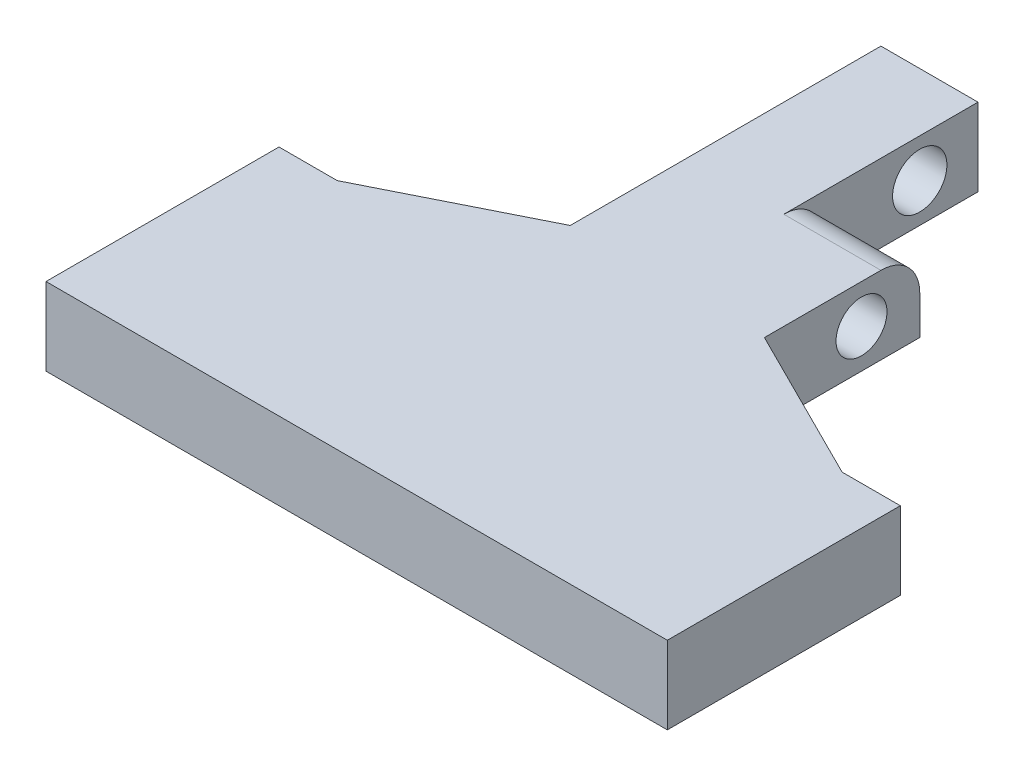
ISO-10303-21;
HEADER;
FILE_DESCRIPTION(('STEP AP214'),'2;1');
FILE_NAME('part.step','',(''),(''),'','','');
FILE_SCHEMA(('AUTOMOTIVE_DESIGN { 1 0 10303 214 1 1 1 1 }'));
ENDSEC;
DATA;
#1=APPLICATION_CONTEXT('core data for automotive mechanical design processes');
#2=APPLICATION_PROTOCOL_DEFINITION('international standard','automotive_design',2000,#1);
#3=PRODUCT_CONTEXT('',#1,'mechanical');
#4=PRODUCT('Part','Part','',(#3));
#5=PRODUCT_RELATED_PRODUCT_CATEGORY('part','',(#4));
#6=PRODUCT_DEFINITION_FORMATION('','',#4);
#7=PRODUCT_DEFINITION_CONTEXT('part definition',#1,'design');
#8=PRODUCT_DEFINITION('design','',#6,#7);
#9=PRODUCT_DEFINITION_SHAPE('','',#8);
#10=(LENGTH_UNIT() NAMED_UNIT(*) SI_UNIT(.MILLI.,.METRE.));
#11=(NAMED_UNIT(*) PLANE_ANGLE_UNIT() SI_UNIT($,.RADIAN.));
#12=(NAMED_UNIT(*) SI_UNIT($,.STERADIAN.) SOLID_ANGLE_UNIT());
#13=UNCERTAINTY_MEASURE_WITH_UNIT(LENGTH_MEASURE(1.E-05),#10,'distance_accuracy_value','');
#14=(GEOMETRIC_REPRESENTATION_CONTEXT(3) GLOBAL_UNCERTAINTY_ASSIGNED_CONTEXT((#13)) GLOBAL_UNIT_ASSIGNED_CONTEXT((#10,
#11,#12)) REPRESENTATION_CONTEXT('',''));
#15=CARTESIAN_POINT('',(0.,0.,0.));
#16=DIRECTION('',(0.,0.,1.));
#17=DIRECTION('',(1.,0.,0.));
#18=AXIS2_PLACEMENT_3D('',#15,#16,#17);
#19=CARTESIAN_POINT('',(0.,6.35,-7.37962983447136));
#20=DIRECTION('',(0.,0.,-1.));
#21=DIRECTION('',(-1.,0.,0.));
#22=AXIS2_PLACEMENT_3D('',#19,#20,#21);
#23=PLANE('',#22);
#24=DIRECTION('',(1.,0.,0.));
#25=VECTOR('',#24,1.);
#26=CARTESIAN_POINT('',(0.,0.,-7.37962983447136));
#27=LINE('',#26,#25);
#28=CARTESIAN_POINT('',(68.0048095270401,0.,-7.37962983447136));
#29=VERTEX_POINT('',#28);
#30=CARTESIAN_POINT('',(72.7673095270401,0.,-7.37962983447136));
#31=VERTEX_POINT('',#30);
#32=EDGE_CURVE('E214',#29,#31,#27,.T.);
#33=ORIENTED_EDGE('',*,*,#32,.F.);
#34=DIRECTION('',(0.,-1.,0.));
#35=VECTOR('',#34,1.);
#36=CARTESIAN_POINT('',(68.0048095270401,6.35,-7.37962983447136));
#37=LINE('',#36,#35);
#38=CARTESIAN_POINT('',(68.0048095270401,6.35,-7.37962983447136));
#39=VERTEX_POINT('',#38);
#40=EDGE_CURVE('E274',#39,#29,#37,.T.);
#41=ORIENTED_EDGE('',*,*,#40,.F.);
#42=DIRECTION('',(1.,0.,0.));
#43=VECTOR('',#42,1.);
#44=CARTESIAN_POINT('',(0.,6.35,-7.37962983447136));
#45=LINE('',#44,#43);
#46=CARTESIAN_POINT('',(72.7673095270401,6.35,-7.37962983447136));
#47=VERTEX_POINT('',#46);
#48=EDGE_CURVE('E177',#39,#47,#45,.T.);
#49=ORIENTED_EDGE('',*,*,#48,.T.);
#50=DIRECTION('',(0.,-1.,0.));
#51=VECTOR('',#50,1.);
#52=CARTESIAN_POINT('',(72.7673095270401,6.35,-7.37962983447136));
#53=LINE('',#52,#51);
#54=EDGE_CURVE('E213',#47,#31,#53,.T.);
#55=ORIENTED_EDGE('',*,*,#54,.T.);
#56=EDGE_LOOP('',(#33,#41,#49,#55));
#57=FACE_BOUND('',#56,.T.);
#58=ADVANCED_FACE('F41',(#57),#23,.T.);
#59=CARTESIAN_POINT('',(16.5528138391965,6.35,-33.1056276783931));
#60=DIRECTION('',(-0.447213595499957,0.,0.894427190999916));
#61=DIRECTION('',(0.894427190999916,0.,0.447213595499957));
#62=AXIS2_PLACEMENT_3D('',#59,#60,#61);
#63=PLANE('',#62);
#64=DIRECTION('',(-0.894427190999916,0.,-0.447213595499957));
#65=VECTOR('',#64,1.);
#66=CARTESIAN_POINT('',(16.5528138391965,0.,-33.1056276783931));
#67=LINE('',#66,#65);
#68=CARTESIAN_POINT('',(55.3048095270401,0.,-13.7296298344713));
#69=VERTEX_POINT('',#68);
#70=EDGE_CURVE('E218',#29,#69,#67,.T.);
#71=ORIENTED_EDGE('',*,*,#70,.T.);
#72=DIRECTION('',(0.,-1.,0.));
#73=VECTOR('',#72,1.);
#74=CARTESIAN_POINT('',(55.3048095270401,6.35,-13.7296298344713));
#75=LINE('',#74,#73);
#76=CARTESIAN_POINT('',(55.3048095270401,6.35,-13.7296298344713));
#77=VERTEX_POINT('',#76);
#78=EDGE_CURVE('E270',#77,#69,#75,.T.);
#79=ORIENTED_EDGE('',*,*,#78,.F.);
#80=DIRECTION('',(-0.894427190999916,0.,-0.447213595499957));
#81=VECTOR('',#80,1.);
#82=CARTESIAN_POINT('',(16.5528138391965,6.35,-33.1056276783931));
#83=LINE('',#82,#81);
#84=EDGE_CURVE('E181',#39,#77,#83,.T.);
#85=ORIENTED_EDGE('',*,*,#84,.F.);
#86=ORIENTED_EDGE('',*,*,#40,.T.);
#87=EDGE_LOOP('',(#71,#79,#85,#86));
#88=FACE_BOUND('',#87,.T.);
#89=ADVANCED_FACE('F333',(#88),#63,.F.);
#90=CARTESIAN_POINT('',(55.3048095270401,6.35,0.));
#91=DIRECTION('',(-1.,0.,0.));
#92=DIRECTION('',(0.,0.,1.));
#93=AXIS2_PLACEMENT_3D('',#90,#91,#92);
#94=PLANE('',#93);
#95=CARTESIAN_POINT('',(55.3048095270401,3.175,-21.6671298344713));
#96=DIRECTION('',(1.,0.,0.));
#97=DIRECTION('',(0.,0.,-1.));
#98=AXIS2_PLACEMENT_3D('',#95,#96,#97);
#99=CIRCLE('',#98,2.0828);
#100=CARTESIAN_POINT('',(55.3048095270401,3.175,-23.7499298344713));
#101=VERTEX_POINT('',#100);
#102=EDGE_CURVE('E172',#101,#101,#99,.T.);
#103=ORIENTED_EDGE('',*,*,#102,.F.);
#104=EDGE_LOOP('',(#103));
#105=FACE_BOUND('',#104,.T.);
#106=DIRECTION('',(0.,1.,0.));
#107=VECTOR('',#106,1.);
#108=CARTESIAN_POINT('',(55.3048095270401,0.,-26.4296298344714));
#109=LINE('',#108,#107);
#110=CARTESIAN_POINT('',(55.3048095270401,0.,-26.4296298344714));
#111=VERTEX_POINT('',#110);
#112=CARTESIAN_POINT('',(55.3048095270401,3.175,-26.4296298344714));
#113=VERTEX_POINT('',#112);
#114=EDGE_CURVE('E147',#111,#113,#109,.T.);
#115=ORIENTED_EDGE('',*,*,#114,.T.);
#116=CARTESIAN_POINT('',(55.3048095270401,3.175,-23.2546298344714));
#117=DIRECTION('',(-1.,0.,0.));
#118=DIRECTION('',(0.,0.,1.));
#119=AXIS2_PLACEMENT_3D('',#116,#117,#118);
#120=CIRCLE('',#119,3.175);
#121=CARTESIAN_POINT('',(55.3048095270401,6.35,-23.2546298344714));
#122=VERTEX_POINT('',#121);
#123=EDGE_CURVE('E64',#113,#122,#120,.F.);
#124=ORIENTED_EDGE('',*,*,#123,.T.);
#125=DIRECTION('',(0.,0.,-1.));
#126=VECTOR('',#125,1.);
#127=CARTESIAN_POINT('',(55.3048095270401,6.35,0.));
#128=LINE('',#127,#126);
#129=EDGE_CURVE('E185',#77,#122,#128,.T.);
#130=ORIENTED_EDGE('',*,*,#129,.F.);
#131=ORIENTED_EDGE('',*,*,#78,.T.);
#132=DIRECTION('',(0.,0.,-1.));
#133=VECTOR('',#132,1.);
#134=CARTESIAN_POINT('',(55.3048095270401,0.,0.));
#135=LINE('',#134,#133);
#136=EDGE_CURVE('E222',#69,#111,#135,.T.);
#137=ORIENTED_EDGE('',*,*,#136,.T.);
#138=EDGE_LOOP('',(#115,#124,#130,#131,#137));
#139=FACE_BOUND('',#138,.T.);
#140=ADVANCED_FACE('F296',(#105,#139),#94,.F.);
#141=CARTESIAN_POINT('',(0.,6.35,-39.1296298344714));
#142=DIRECTION('',(0.,0.,1.));
#143=DIRECTION('',(1.,0.,0.));
#144=AXIS2_PLACEMENT_3D('',#141,#142,#143);
#145=PLANE('',#144);
#146=DIRECTION('',(-1.,0.,0.));
#147=VECTOR('',#146,1.);
#148=CARTESIAN_POINT('',(0.,6.35,-39.1296298344714));
#149=LINE('',#148,#147);
#150=CARTESIAN_POINT('',(47.3673095270401,6.35,-39.1296298344714));
#151=VERTEX_POINT('',#150);
#152=CARTESIAN_POINT('',(39.4298095270401,6.35,-39.1296298344714));
#153=VERTEX_POINT('',#152);
#154=EDGE_CURVE('E188',#151,#153,#149,.T.);
#155=ORIENTED_EDGE('',*,*,#154,.F.);
#156=DIRECTION('',(0.,1.,0.));
#157=VECTOR('',#156,1.);
#158=CARTESIAN_POINT('',(47.3673095270401,0.,-39.1296298344714));
#159=LINE('',#158,#157);
#160=CARTESIAN_POINT('',(47.3673095270401,0.,-39.1296298344714));
#161=VERTEX_POINT('',#160);
#162=EDGE_CURVE('E166',#161,#151,#159,.T.);
#163=ORIENTED_EDGE('',*,*,#162,.F.);
#164=DIRECTION('',(-1.,0.,0.));
#165=VECTOR('',#164,1.);
#166=CARTESIAN_POINT('',(0.,0.,-39.1296298344714));
#167=LINE('',#166,#165);
#168=CARTESIAN_POINT('',(39.4298095270401,0.,-39.1296298344714));
#169=VERTEX_POINT('',#168);
#170=EDGE_CURVE('E160',#161,#169,#167,.T.);
#171=ORIENTED_EDGE('',*,*,#170,.T.);
#172=DIRECTION('',(0.,-1.,0.));
#173=VECTOR('',#172,1.);
#174=CARTESIAN_POINT('',(39.4298095270401,6.35,-39.1296298344714));
#175=LINE('',#174,#173);
#176=EDGE_CURVE('E266',#153,#169,#175,.T.);
#177=ORIENTED_EDGE('',*,*,#176,.F.);
#178=EDGE_LOOP('',(#155,#163,#171,#177));
#179=FACE_BOUND('',#178,.T.);
#180=ADVANCED_FACE('F332',(#179),#145,.F.);
#181=CARTESIAN_POINT('',(39.4298095270401,6.35,0.));
#182=DIRECTION('',(-1.,0.,0.));
#183=DIRECTION('',(0.,0.,1.));
#184=AXIS2_PLACEMENT_3D('',#181,#182,#183);
#185=PLANE('',#184);
#186=CARTESIAN_POINT('',(39.4298095270401,3.175,-21.6671298344713));
#187=DIRECTION('',(-1.,0.,0.));
#188=DIRECTION('',(0.,0.,1.));
#189=AXIS2_PLACEMENT_3D('',#186,#187,#188);
#190=CIRCLE('',#189,2.0828);
#191=CARTESIAN_POINT('',(39.4298095270401,3.175,-19.5843298344714));
#192=VERTEX_POINT('',#191);
#193=EDGE_CURVE('E219',#192,#192,#190,.T.);
#194=ORIENTED_EDGE('',*,*,#193,.F.);
#195=EDGE_LOOP('',(#194));
#196=FACE_BOUND('',#195,.T.);
#197=CARTESIAN_POINT('',(39.4298095270401,3.175,-34.3671298344714));
#198=DIRECTION('',(-1.,0.,0.));
#199=DIRECTION('',(0.,0.,1.));
#200=AXIS2_PLACEMENT_3D('',#197,#198,#199);
#201=CIRCLE('',#200,2.2225);
#202=CARTESIAN_POINT('',(39.4298095270401,3.175,-32.1446298344714));
#203=VERTEX_POINT('',#202);
#204=EDGE_CURVE('E176',#203,#203,#201,.T.);
#205=ORIENTED_EDGE('',*,*,#204,.F.);
#206=EDGE_LOOP('',(#205));
#207=FACE_BOUND('',#206,.T.);
#208=DIRECTION('',(0.,0.,-1.));
#209=VECTOR('',#208,1.);
#210=CARTESIAN_POINT('',(39.4298095270401,0.,0.));
#211=LINE('',#210,#209);
#212=CARTESIAN_POINT('',(39.4298095270401,0.,-13.7296298344714));
#213=VERTEX_POINT('',#212);
#214=EDGE_CURVE('E227',#213,#169,#211,.T.);
#215=ORIENTED_EDGE('',*,*,#214,.F.);
#216=DIRECTION('',(0.,-1.,0.));
#217=VECTOR('',#216,1.);
#218=CARTESIAN_POINT('',(39.4298095270401,6.35,-13.7296298344714));
#219=LINE('',#218,#217);
#220=CARTESIAN_POINT('',(39.4298095270401,6.35,-13.7296298344714));
#221=VERTEX_POINT('',#220);
#222=EDGE_CURVE('E263',#221,#213,#219,.T.);
#223=ORIENTED_EDGE('',*,*,#222,.F.);
#224=DIRECTION('',(0.,0.,-1.));
#225=VECTOR('',#224,1.);
#226=CARTESIAN_POINT('',(39.4298095270401,6.35,0.));
#227=LINE('',#226,#225);
#228=EDGE_CURVE('E191',#221,#153,#227,.T.);
#229=ORIENTED_EDGE('',*,*,#228,.T.);
#230=ORIENTED_EDGE('',*,*,#176,.T.);
#231=EDGE_LOOP('',(#215,#223,#229,#230));
#232=FACE_BOUND('',#231,.T.);
#233=ADVANCED_FACE('F329',(#196,#207,#232),#185,.T.);
#234=CARTESIAN_POINT('',(2.39410997161946,6.35,4.78821994323893));
#235=DIRECTION('',(-0.447213595499957,0.,-0.894427190999916));
#236=DIRECTION('',(-0.894427190999916,0.,0.447213595499957));
#237=AXIS2_PLACEMENT_3D('',#234,#235,#236);
#238=PLANE('',#237);
#239=DIRECTION('',(0.894427190999916,0.,-0.447213595499957));
#240=VECTOR('',#239,1.);
#241=CARTESIAN_POINT('',(2.39410997161946,0.,4.78821994323893));
#242=LINE('',#241,#240);
#243=CARTESIAN_POINT('',(26.7298095270401,0.,-7.37962983447136));
#244=VERTEX_POINT('',#243);
#245=EDGE_CURVE('E230',#244,#213,#242,.T.);
#246=ORIENTED_EDGE('',*,*,#245,.F.);
#247=DIRECTION('',(0.,-1.,0.));
#248=VECTOR('',#247,1.);
#249=CARTESIAN_POINT('',(26.7298095270401,6.35,-7.37962983447136));
#250=LINE('',#249,#248);
#251=CARTESIAN_POINT('',(26.7298095270401,6.35,-7.37962983447136));
#252=VERTEX_POINT('',#251);
#253=EDGE_CURVE('E260',#252,#244,#250,.T.);
#254=ORIENTED_EDGE('',*,*,#253,.F.);
#255=DIRECTION('',(0.894427190999916,0.,-0.447213595499957));
#256=VECTOR('',#255,1.);
#257=CARTESIAN_POINT('',(2.39410997161946,6.35,4.78821994323893));
#258=LINE('',#257,#256);
#259=EDGE_CURVE('E195',#252,#221,#258,.T.);
#260=ORIENTED_EDGE('',*,*,#259,.T.);
#261=ORIENTED_EDGE('',*,*,#222,.T.);
#262=EDGE_LOOP('',(#246,#254,#260,#261));
#263=FACE_BOUND('',#262,.T.);
#264=ADVANCED_FACE('F325',(#263),#238,.T.);
#265=CARTESIAN_POINT('',(0.,6.35,-7.37962983447136));
#266=DIRECTION('',(0.,0.,-1.));
#267=DIRECTION('',(-1.,0.,0.));
#268=AXIS2_PLACEMENT_3D('',#265,#266,#267);
#269=PLANE('',#268);
#270=DIRECTION('',(1.,0.,0.));
#271=VECTOR('',#270,1.);
#272=CARTESIAN_POINT('',(0.,0.,-7.37962983447136));
#273=LINE('',#272,#271);
#274=CARTESIAN_POINT('',(21.9673095270401,0.,-7.37962983447136));
#275=VERTEX_POINT('',#274);
#276=EDGE_CURVE('E234',#275,#244,#273,.T.);
#277=ORIENTED_EDGE('',*,*,#276,.F.);
#278=DIRECTION('',(0.,-1.,0.));
#279=VECTOR('',#278,1.);
#280=CARTESIAN_POINT('',(21.9673095270401,6.35,-7.37962983447136));
#281=LINE('',#280,#279);
#282=CARTESIAN_POINT('',(21.9673095270401,6.35,-7.37962983447136));
#283=VERTEX_POINT('',#282);
#284=EDGE_CURVE('E257',#283,#275,#281,.T.);
#285=ORIENTED_EDGE('',*,*,#284,.F.);
#286=DIRECTION('',(1.,0.,0.));
#287=VECTOR('',#286,1.);
#288=CARTESIAN_POINT('',(0.,6.35,-7.37962983447136));
#289=LINE('',#288,#287);
#290=EDGE_CURVE('E199',#283,#252,#289,.T.);
#291=ORIENTED_EDGE('',*,*,#290,.T.);
#292=ORIENTED_EDGE('',*,*,#253,.T.);
#293=EDGE_LOOP('',(#277,#285,#291,#292));
#294=FACE_BOUND('',#293,.T.);
#295=ADVANCED_FACE('F321',(#294),#269,.T.);
#296=CARTESIAN_POINT('',(21.9673095270401,6.35,0.));
#297=DIRECTION('',(1.,0.,0.));
#298=DIRECTION('',(0.,0.,-1.));
#299=AXIS2_PLACEMENT_3D('',#296,#297,#298);
#300=PLANE('',#299);
#301=DIRECTION('',(0.,0.,1.));
#302=VECTOR('',#301,1.);
#303=CARTESIAN_POINT('',(21.9673095270401,0.,0.));
#304=LINE('',#303,#302);
#305=CARTESIAN_POINT('',(21.9673095270401,0.,11.6703701655286));
#306=VERTEX_POINT('',#305);
#307=EDGE_CURVE('E238',#275,#306,#304,.T.);
#308=ORIENTED_EDGE('',*,*,#307,.T.);
#309=DIRECTION('',(0.,-1.,0.));
#310=VECTOR('',#309,1.);
#311=CARTESIAN_POINT('',(21.9673095270401,6.35,11.6703701655286));
#312=LINE('',#311,#310);
#313=CARTESIAN_POINT('',(21.9673095270401,6.35,11.6703701655286));
#314=VERTEX_POINT('',#313);
#315=EDGE_CURVE('E253',#314,#306,#312,.T.);
#316=ORIENTED_EDGE('',*,*,#315,.F.);
#317=DIRECTION('',(0.,0.,1.));
#318=VECTOR('',#317,1.);
#319=CARTESIAN_POINT('',(21.9673095270401,6.35,0.));
#320=LINE('',#319,#318);
#321=EDGE_CURVE('E203',#283,#314,#320,.T.);
#322=ORIENTED_EDGE('',*,*,#321,.F.);
#323=ORIENTED_EDGE('',*,*,#284,.T.);
#324=EDGE_LOOP('',(#308,#316,#322,#323));
#325=FACE_BOUND('',#324,.T.);
#326=ADVANCED_FACE('F318',(#325),#300,.F.);
#327=CARTESIAN_POINT('',(0.,6.35,11.6703701655286));
#328=DIRECTION('',(0.,0.,-1.));
#329=DIRECTION('',(-1.,0.,0.));
#330=AXIS2_PLACEMENT_3D('',#327,#328,#329);
#331=PLANE('',#330);
#332=DIRECTION('',(1.,0.,0.));
#333=VECTOR('',#332,1.);
#334=CARTESIAN_POINT('',(0.,0.,11.6703701655286));
#335=LINE('',#334,#333);
#336=CARTESIAN_POINT('',(72.7673095270401,0.,11.6703701655286));
#337=VERTEX_POINT('',#336);
#338=EDGE_CURVE('E241',#306,#337,#335,.T.);
#339=ORIENTED_EDGE('',*,*,#338,.T.);
#340=DIRECTION('',(0.,-1.,0.));
#341=VECTOR('',#340,1.);
#342=CARTESIAN_POINT('',(72.7673095270401,6.35,11.6703701655286));
#343=LINE('',#342,#341);
#344=CARTESIAN_POINT('',(72.7673095270401,6.35,11.6703701655286));
#345=VERTEX_POINT('',#344);
#346=EDGE_CURVE('E250',#345,#337,#343,.T.);
#347=ORIENTED_EDGE('',*,*,#346,.F.);
#348=DIRECTION('',(1.,0.,0.));
#349=VECTOR('',#348,1.);
#350=CARTESIAN_POINT('',(0.,6.35,11.6703701655286));
#351=LINE('',#350,#349);
#352=EDGE_CURVE('E206',#314,#345,#351,.T.);
#353=ORIENTED_EDGE('',*,*,#352,.F.);
#354=ORIENTED_EDGE('',*,*,#315,.T.);
#355=EDGE_LOOP('',(#339,#347,#353,#354));
#356=FACE_BOUND('',#355,.T.);
#357=ADVANCED_FACE('F313',(#356),#331,.F.);
#358=CARTESIAN_POINT('',(72.7673095270401,6.35,0.));
#359=DIRECTION('',(1.,0.,0.));
#360=DIRECTION('',(0.,0.,-1.));
#361=AXIS2_PLACEMENT_3D('',#358,#359,#360);
#362=PLANE('',#361);
#363=DIRECTION('',(0.,0.,1.));
#364=VECTOR('',#363,1.);
#365=CARTESIAN_POINT('',(72.7673095270401,0.,0.));
#366=LINE('',#365,#364);
#367=EDGE_CURVE('E182',#31,#337,#366,.T.);
#368=ORIENTED_EDGE('',*,*,#367,.F.);
#369=ORIENTED_EDGE('',*,*,#54,.F.);
#370=DIRECTION('',(0.,0.,1.));
#371=VECTOR('',#370,1.);
#372=CARTESIAN_POINT('',(72.7673095270401,6.35,0.));
#373=LINE('',#372,#371);
#374=EDGE_CURVE('E209',#47,#345,#373,.T.);
#375=ORIENTED_EDGE('',*,*,#374,.T.);
#376=ORIENTED_EDGE('',*,*,#346,.T.);
#377=EDGE_LOOP('',(#368,#369,#375,#376));
#378=FACE_BOUND('',#377,.T.);
#379=ADVANCED_FACE('F307',(#378),#362,.T.);
#380=CARTESIAN_POINT('',(0.,6.35,0.));
#381=DIRECTION('',(0.,1.,0.));
#382=DIRECTION('',(0.,0.,1.));
#383=AXIS2_PLACEMENT_3D('',#380,#381,#382);
#384=PLANE('',#383);
#385=ORIENTED_EDGE('',*,*,#129,.T.);
#386=DIRECTION('',(1.,0.,0.));
#387=VECTOR('',#386,1.);
#388=CARTESIAN_POINT('',(47.3673095270401,6.35,-23.2546298344714));
#389=LINE('',#388,#387);
#390=CARTESIAN_POINT('',(47.3673095270401,6.35,-23.2546298344714));
#391=VERTEX_POINT('',#390);
#392=EDGE_CURVE('E50',#122,#391,#389,.F.);
#393=ORIENTED_EDGE('',*,*,#392,.T.);
#394=DIRECTION('',(0.,0.,1.));
#395=VECTOR('',#394,1.);
#396=CARTESIAN_POINT('',(47.3673095270401,6.35,0.));
#397=LINE('',#396,#395);
#398=EDGE_CURVE('E56',#151,#391,#397,.T.);
#399=ORIENTED_EDGE('',*,*,#398,.F.);
#400=ORIENTED_EDGE('',*,*,#154,.T.);
#401=ORIENTED_EDGE('',*,*,#228,.F.);
#402=ORIENTED_EDGE('',*,*,#259,.F.);
#403=ORIENTED_EDGE('',*,*,#290,.F.);
#404=ORIENTED_EDGE('',*,*,#321,.T.);
#405=ORIENTED_EDGE('',*,*,#352,.T.);
#406=ORIENTED_EDGE('',*,*,#374,.F.);
#407=ORIENTED_EDGE('',*,*,#48,.F.);
#408=ORIENTED_EDGE('',*,*,#84,.T.);
#409=EDGE_LOOP('',(#385,#393,#399,#400,#401,#402,#403,#404,#405,#406,#407,#408));
#410=FACE_BOUND('',#409,.T.);
#411=ADVANCED_FACE('F293',(#410),#384,.T.);
#412=CARTESIAN_POINT('',(0.,0.,0.));
#413=DIRECTION('',(0.,1.,0.));
#414=DIRECTION('',(0.,0.,1.));
#415=AXIS2_PLACEMENT_3D('',#412,#413,#414);
#416=PLANE('',#415);
#417=ORIENTED_EDGE('',*,*,#170,.F.);
#418=DIRECTION('',(0.,0.,1.));
#419=VECTOR('',#418,1.);
#420=CARTESIAN_POINT('',(47.3673095270401,0.,0.));
#421=LINE('',#420,#419);
#422=CARTESIAN_POINT('',(47.3673095270401,0.,-26.4296298344714));
#423=VERTEX_POINT('',#422);
#424=EDGE_CURVE('E140',#161,#423,#421,.T.);
#425=ORIENTED_EDGE('',*,*,#424,.T.);
#426=DIRECTION('',(1.,0.,0.));
#427=VECTOR('',#426,1.);
#428=CARTESIAN_POINT('',(0.,0.,-26.4296298344714));
#429=LINE('',#428,#427);
#430=EDGE_CURVE('E148',#423,#111,#429,.T.);
#431=ORIENTED_EDGE('',*,*,#430,.T.);
#432=ORIENTED_EDGE('',*,*,#136,.F.);
#433=ORIENTED_EDGE('',*,*,#70,.F.);
#434=ORIENTED_EDGE('',*,*,#32,.T.);
#435=ORIENTED_EDGE('',*,*,#367,.T.);
#436=ORIENTED_EDGE('',*,*,#338,.F.);
#437=ORIENTED_EDGE('',*,*,#307,.F.);
#438=ORIENTED_EDGE('',*,*,#276,.T.);
#439=ORIENTED_EDGE('',*,*,#245,.T.);
#440=ORIENTED_EDGE('',*,*,#214,.T.);
#441=EDGE_LOOP('',(#417,#425,#431,#432,#433,#434,#435,#436,#437,#438,#439,#440));
#442=FACE_BOUND('',#441,.T.);
#443=ADVANCED_FACE('F158',(#442),#416,.F.);
#444=CARTESIAN_POINT('',(4.50480952704009,3.175,-34.3671298344714));
#445=DIRECTION('',(1.,0.,0.));
#446=DIRECTION('',(0.,0.,-1.));
#447=AXIS2_PLACEMENT_3D('',#444,#445,#446);
#448=CYLINDRICAL_SURFACE('',#447,2.2225);
#449=CARTESIAN_POINT('',(47.3673095270401,3.175,-34.3671298344714));
#450=DIRECTION('',(-1.,0.,0.));
#451=DIRECTION('',(0.,0.,1.));
#452=AXIS2_PLACEMENT_3D('',#449,#450,#451);
#453=CIRCLE('',#452,2.2225);
#454=CARTESIAN_POINT('',(47.3673095270401,3.175,-32.1446298344714));
#455=VERTEX_POINT('',#454);
#456=EDGE_CURVE('E169',#455,#455,#453,.F.);
#457=ORIENTED_EDGE('',*,*,#456,.T.);
#458=EDGE_LOOP('',(#457));
#459=FACE_BOUND('',#458,.T.);
#460=ORIENTED_EDGE('',*,*,#204,.T.);
#461=EDGE_LOOP('',(#460));
#462=FACE_BOUND('',#461,.T.);
#463=ADVANCED_FACE('F360',(#459,#462),#448,.F.);
#464=CARTESIAN_POINT('',(4.50480952704009,3.175,-21.6671298344713));
#465=DIRECTION('',(1.,0.,0.));
#466=DIRECTION('',(0.,0.,-1.));
#467=AXIS2_PLACEMENT_3D('',#464,#465,#466);
#468=CYLINDRICAL_SURFACE('',#467,2.0828);
#469=ORIENTED_EDGE('',*,*,#193,.T.);
#470=EDGE_LOOP('',(#469));
#471=FACE_BOUND('',#470,.T.);
#472=ORIENTED_EDGE('',*,*,#102,.T.);
#473=EDGE_LOOP('',(#472));
#474=FACE_BOUND('',#473,.T.);
#475=ADVANCED_FACE('F365',(#471,#474),#468,.F.);
#476=CARTESIAN_POINT('',(47.3673095270401,0.,0.));
#477=DIRECTION('',(-1.,0.,0.));
#478=DIRECTION('',(0.,0.,1.));
#479=AXIS2_PLACEMENT_3D('',#476,#477,#478);
#480=PLANE('',#479);
#481=ORIENTED_EDGE('',*,*,#398,.T.);
#482=CARTESIAN_POINT('',(47.3673095270401,3.175,-23.2546298344714));
#483=DIRECTION('',(-1.,0.,0.));
#484=DIRECTION('',(0.,0.,1.));
#485=AXIS2_PLACEMENT_3D('',#482,#483,#484);
#486=CIRCLE('',#485,3.175);
#487=CARTESIAN_POINT('',(47.3673095270401,3.175,-26.4296298344714));
#488=VERTEX_POINT('',#487);
#489=EDGE_CURVE('E11',#391,#488,#486,.T.);
#490=ORIENTED_EDGE('',*,*,#489,.T.);
#491=DIRECTION('',(0.,1.,0.));
#492=VECTOR('',#491,1.);
#493=CARTESIAN_POINT('',(47.3673095270401,0.,-26.4296298344714));
#494=LINE('',#493,#492);
#495=EDGE_CURVE('E135',#423,#488,#494,.T.);
#496=ORIENTED_EDGE('',*,*,#495,.F.);
#497=ORIENTED_EDGE('',*,*,#424,.F.);
#498=ORIENTED_EDGE('',*,*,#162,.T.);
#499=EDGE_LOOP('',(#481,#490,#496,#497,#498));
#500=FACE_BOUND('',#499,.T.);
#501=ORIENTED_EDGE('',*,*,#456,.F.);
#502=EDGE_LOOP('',(#501));
#503=FACE_BOUND('',#502,.T.);
#504=ADVANCED_FACE('F137',(#500,#503),#480,.F.);
#505=CARTESIAN_POINT('',(0.,0.,-26.4296298344714));
#506=DIRECTION('',(0.,0.,1.));
#507=DIRECTION('',(1.,0.,0.));
#508=AXIS2_PLACEMENT_3D('',#505,#506,#507);
#509=PLANE('',#508);
#510=ORIENTED_EDGE('',*,*,#495,.T.);
#511=DIRECTION('',(1.,0.,0.));
#512=VECTOR('',#511,1.);
#513=CARTESIAN_POINT('',(55.3048095270401,3.175,-26.4296298344714));
#514=LINE('',#513,#512);
#515=EDGE_CURVE('E277',#488,#113,#514,.T.);
#516=ORIENTED_EDGE('',*,*,#515,.T.);
#517=ORIENTED_EDGE('',*,*,#114,.F.);
#518=ORIENTED_EDGE('',*,*,#430,.F.);
#519=EDGE_LOOP('',(#510,#516,#517,#518));
#520=FACE_BOUND('',#519,.T.);
#521=ADVANCED_FACE('F151',(#520),#509,.F.);
#522=CARTESIAN_POINT('',(0.,3.175,-23.2546298344714));
#523=DIRECTION('',(-1.,0.,0.));
#524=DIRECTION('',(0.,0.,1.));
#525=AXIS2_PLACEMENT_3D('',#522,#523,#524);
#526=CYLINDRICAL_SURFACE('',#525,3.175);
#527=ORIENTED_EDGE('',*,*,#489,.F.);
#528=ORIENTED_EDGE('',*,*,#392,.F.);
#529=ORIENTED_EDGE('',*,*,#123,.F.);
#530=ORIENTED_EDGE('',*,*,#515,.F.);
#531=EDGE_LOOP('',(#527,#528,#529,#530));
#532=FACE_BOUND('',#531,.T.);
#533=ADVANCED_FACE('F43',(#532),#526,.T.);
#534=CLOSED_SHELL('',(#58,#89,#140,#180,#233,#264,#295,#326,#357,#379,#411,#443,#463,#475,#504,
#521,#533));
#535=MANIFOLD_SOLID_BREP('B2',#534);
#536=ADVANCED_BREP_SHAPE_REPRESENTATION('',(#18,#535),#14);
#537=SHAPE_DEFINITION_REPRESENTATION(#9,#536);
ENDSEC;
END-ISO-10303-21;
